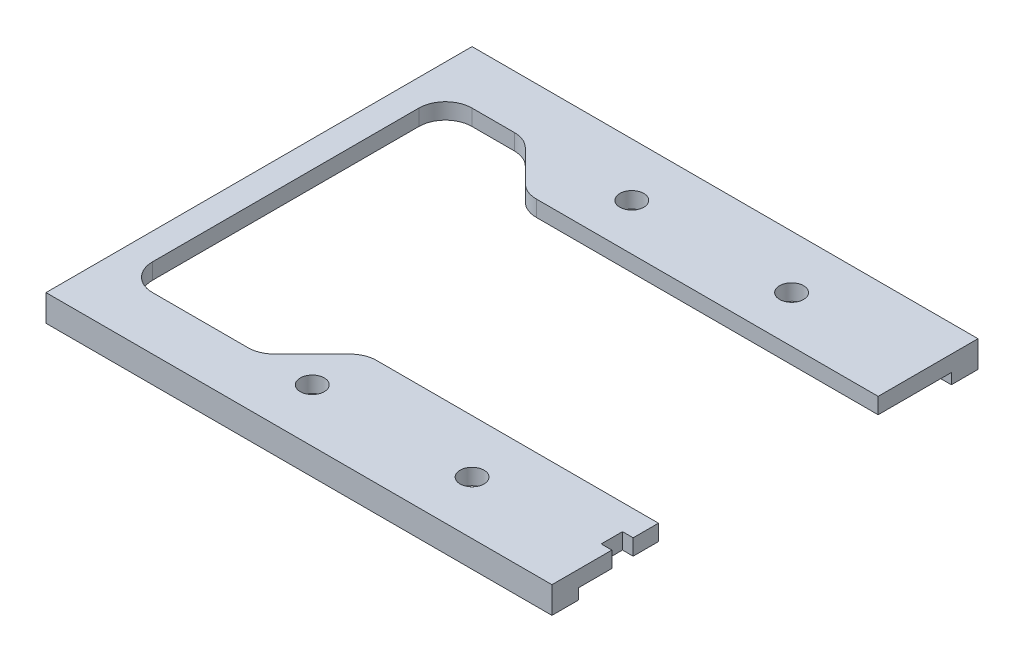
ISO-10303-21;
HEADER;
FILE_DESCRIPTION(('STEP AP214'),'2;1');
FILE_NAME('part.step','',(''),(''),'','','');
FILE_SCHEMA(('AUTOMOTIVE_DESIGN { 1 0 10303 214 1 1 1 1 }'));
ENDSEC;
DATA;
#1=APPLICATION_CONTEXT('core data for automotive mechanical design processes');
#2=APPLICATION_PROTOCOL_DEFINITION('international standard','automotive_design',2000,#1);
#3=PRODUCT_CONTEXT('',#1,'mechanical');
#4=PRODUCT('Part','Part','',(#3));
#5=PRODUCT_RELATED_PRODUCT_CATEGORY('part','',(#4));
#6=PRODUCT_DEFINITION_FORMATION('','',#4);
#7=PRODUCT_DEFINITION_CONTEXT('part definition',#1,'design');
#8=PRODUCT_DEFINITION('design','',#6,#7);
#9=PRODUCT_DEFINITION_SHAPE('','',#8);
#10=(LENGTH_UNIT() NAMED_UNIT(*) SI_UNIT(.MILLI.,.METRE.));
#11=(NAMED_UNIT(*) PLANE_ANGLE_UNIT() SI_UNIT($,.RADIAN.));
#12=(NAMED_UNIT(*) SI_UNIT($,.STERADIAN.) SOLID_ANGLE_UNIT());
#13=UNCERTAINTY_MEASURE_WITH_UNIT(LENGTH_MEASURE(1.E-05),#10,'distance_accuracy_value','');
#14=(GEOMETRIC_REPRESENTATION_CONTEXT(3) GLOBAL_UNCERTAINTY_ASSIGNED_CONTEXT((#13)) GLOBAL_UNIT_ASSIGNED_CONTEXT((#10,
#11,#12)) REPRESENTATION_CONTEXT('',''));
#15=CARTESIAN_POINT('',(0.,0.,0.));
#16=DIRECTION('',(0.,0.,1.));
#17=DIRECTION('',(1.,0.,0.));
#18=AXIS2_PLACEMENT_3D('',#15,#16,#17);
#19=CARTESIAN_POINT('',(-9.99999999999797,-4.,9.99999999999848));
#20=DIRECTION('',(-0.70710678118653,0.,0.707106781186566));
#21=DIRECTION('',(-0.707106781186566,0.,-0.70710678118653));
#22=AXIS2_PLACEMENT_3D('',#19,#20,#21);
#23=PLANE('',#22);
#24=DIRECTION('',(-0.707106781186566,0.,-0.70710678118653));
#25=VECTOR('',#24,1.);
#26=CARTESIAN_POINT('',(-9.99999999999797,6.,9.99999999999848));
#27=LINE('',#26,#25);
#28=CARTESIAN_POINT('',(-135.428932188137,6.,-115.428932188134));
#29=VERTEX_POINT('',#28);
#30=CARTESIAN_POINT('',(-147.071067811869,6.,-127.071067811865));
#31=VERTEX_POINT('',#30);
#32=EDGE_CURVE('E224',#29,#31,#27,.T.);
#33=ORIENTED_EDGE('',*,*,#32,.T.);
#34=DIRECTION('',(0.,1.,0.));
#35=VECTOR('',#34,1.);
#36=CARTESIAN_POINT('',(-147.071067811869,-4.,-127.071067811865));
#37=LINE('',#36,#35);
#38=CARTESIAN_POINT('',(-147.071067811869,0.,-127.071067811865));
#39=VERTEX_POINT('',#38);
#40=EDGE_CURVE('E243',#39,#31,#37,.T.);
#41=ORIENTED_EDGE('',*,*,#40,.F.);
#42=DIRECTION('',(0.707106781186566,0.,0.70710678118653));
#43=VECTOR('',#42,1.);
#44=CARTESIAN_POINT('',(-9.99999999999797,0.,9.99999999999848));
#45=LINE('',#44,#43);
#46=CARTESIAN_POINT('',(-135.428932188137,0.,-115.428932188134));
#47=VERTEX_POINT('',#46);
#48=EDGE_CURVE('E226',#39,#47,#45,.T.);
#49=ORIENTED_EDGE('',*,*,#48,.T.);
#50=DIRECTION('',(0.,1.,0.));
#51=VECTOR('',#50,1.);
#52=CARTESIAN_POINT('',(-135.428932188137,-4.,-115.428932188134));
#53=LINE('',#52,#51);
#54=EDGE_CURVE('E216',#47,#29,#53,.T.);
#55=ORIENTED_EDGE('',*,*,#54,.T.);
#56=EDGE_LOOP('',(#33,#41,#49,#55));
#57=FACE_BOUND('',#56,.T.);
#58=ADVANCED_FACE('F41',(#57),#23,.T.);
#59=CARTESIAN_POINT('',(0.,-4.,-112.5));
#60=DIRECTION('',(0.,0.,-1.));
#61=DIRECTION('',(1.,0.,0.));
#62=AXIS2_PLACEMENT_3D('',#59,#60,#61);
#63=PLANE('',#62);
#64=DIRECTION('',(0.,1.,0.));
#65=VECTOR('',#64,1.);
#66=CARTESIAN_POINT('',(-128.357864376272,-4.,-112.5));
#67=LINE('',#66,#65);
#68=CARTESIAN_POINT('',(-128.357864376272,6.,-112.5));
#69=VERTEX_POINT('',#68);
#70=CARTESIAN_POINT('',(-128.357864376272,0.,-112.5));
#71=VERTEX_POINT('',#70);
#72=EDGE_CURVE('E49',#69,#71,#67,.F.);
#73=ORIENTED_EDGE('',*,*,#72,.T.);
#74=DIRECTION('',(-1.,0.,0.));
#75=VECTOR('',#74,1.);
#76=CARTESIAN_POINT('',(0.,0.,-112.5));
#77=LINE('',#76,#75);
#78=CARTESIAN_POINT('',(0.,0.,-112.5));
#79=VERTEX_POINT('',#78);
#80=EDGE_CURVE('E300',#79,#71,#77,.T.);
#81=ORIENTED_EDGE('',*,*,#80,.F.);
#82=DIRECTION('',(0.,1.,0.));
#83=VECTOR('',#82,1.);
#84=CARTESIAN_POINT('',(0.,-4.,-112.5));
#85=LINE('',#84,#83);
#86=CARTESIAN_POINT('',(0.,6.,-112.5));
#87=VERTEX_POINT('',#86);
#88=EDGE_CURVE('E303',#79,#87,#85,.T.);
#89=ORIENTED_EDGE('',*,*,#88,.T.);
#90=DIRECTION('',(1.,0.,0.));
#91=VECTOR('',#90,1.);
#92=CARTESIAN_POINT('',(0.,6.,-112.5));
#93=LINE('',#92,#91);
#94=EDGE_CURVE('E301',#69,#87,#93,.T.);
#95=ORIENTED_EDGE('',*,*,#94,.F.);
#96=EDGE_LOOP('',(#73,#81,#89,#95));
#97=FACE_BOUND('',#96,.T.);
#98=ADVANCED_FACE('F297',(#97),#63,.F.);
#99=CARTESIAN_POINT('',(0.,6.,0.));
#100=DIRECTION('',(-1.,0.,0.));
#101=DIRECTION('',(0.,0.,-1.));
#102=AXIS2_PLACEMENT_3D('',#99,#100,#101);
#103=PLANE('',#102);
#104=DIRECTION('',(0.,0.,1.));
#105=VECTOR('',#104,1.);
#106=CARTESIAN_POINT('',(0.,6.,0.));
#107=LINE('',#106,#105);
#108=CARTESIAN_POINT('',(0.,6.,-12.5));
#109=VERTEX_POINT('',#108);
#110=CARTESIAN_POINT('',(0.,6.,10.));
#111=VERTEX_POINT('',#110);
#112=EDGE_CURVE('E261',#109,#111,#107,.T.);
#113=ORIENTED_EDGE('',*,*,#112,.T.);
#114=DIRECTION('',(0.,-1.,0.));
#115=VECTOR('',#114,1.);
#116=CARTESIAN_POINT('',(0.,6.,10.));
#117=LINE('',#116,#115);
#118=CARTESIAN_POINT('',(0.,-4.,10.));
#119=VERTEX_POINT('',#118);
#120=EDGE_CURVE('E388',#111,#119,#117,.T.);
#121=ORIENTED_EDGE('',*,*,#120,.T.);
#122=DIRECTION('',(0.,0.,-1.));
#123=VECTOR('',#122,1.);
#124=CARTESIAN_POINT('',(0.,-4.,10.));
#125=LINE('',#124,#123);
#126=CARTESIAN_POINT('',(0.,-4.,0.));
#127=VERTEX_POINT('',#126);
#128=EDGE_CURVE('E399',#119,#127,#125,.T.);
#129=ORIENTED_EDGE('',*,*,#128,.T.);
#130=DIRECTION('',(0.,-1.,0.));
#131=VECTOR('',#130,1.);
#132=CARTESIAN_POINT('',(0.,6.,0.));
#133=LINE('',#132,#131);
#134=CARTESIAN_POINT('',(0.,0.,0.));
#135=VERTEX_POINT('',#134);
#136=EDGE_CURVE('E387',#135,#127,#133,.T.);
#137=ORIENTED_EDGE('',*,*,#136,.F.);
#138=DIRECTION('',(0.,0.,1.));
#139=VECTOR('',#138,1.);
#140=CARTESIAN_POINT('',(0.,0.,0.));
#141=LINE('',#140,#139);
#142=CARTESIAN_POINT('',(0.,0.,-12.5));
#143=VERTEX_POINT('',#142);
#144=EDGE_CURVE('E245',#143,#135,#141,.T.);
#145=ORIENTED_EDGE('',*,*,#144,.F.);
#146=DIRECTION('',(0.,-1.,0.));
#147=VECTOR('',#146,1.);
#148=CARTESIAN_POINT('',(0.,10.,-12.5));
#149=LINE('',#148,#147);
#150=EDGE_CURVE('E352',#109,#143,#149,.T.);
#151=ORIENTED_EDGE('',*,*,#150,.F.);
#152=EDGE_LOOP('',(#113,#121,#129,#137,#145,#151));
#153=FACE_BOUND('',#152,.T.);
#154=ADVANCED_FACE('F466',(#153),#103,.F.);
#155=CARTESIAN_POINT('',(0.,6.,-30.));
#156=VERTEX_POINT('',#155);
#157=CARTESIAN_POINT('',(0.,6.,-20.5));
#158=VERTEX_POINT('',#157);
#159=EDGE_CURVE('E260',#156,#158,#107,.T.);
#160=ORIENTED_EDGE('',*,*,#159,.T.);
#161=DIRECTION('',(0.,-1.,0.));
#162=VECTOR('',#161,1.);
#163=CARTESIAN_POINT('',(0.,10.,-20.5));
#164=LINE('',#163,#162);
#165=CARTESIAN_POINT('',(0.,0.,-20.5));
#166=VERTEX_POINT('',#165);
#167=EDGE_CURVE('E351',#158,#166,#164,.T.);
#168=ORIENTED_EDGE('',*,*,#167,.T.);
#169=CARTESIAN_POINT('',(0.,0.,-30.));
#170=VERTEX_POINT('',#169);
#171=EDGE_CURVE('E268',#170,#166,#141,.T.);
#172=ORIENTED_EDGE('',*,*,#171,.F.);
#173=DIRECTION('',(0.,1.,0.));
#174=VECTOR('',#173,1.);
#175=CARTESIAN_POINT('',(0.,-4.,-30.));
#176=LINE('',#175,#174);
#177=EDGE_CURVE('E305',#170,#156,#176,.T.);
#178=ORIENTED_EDGE('',*,*,#177,.T.);
#179=EDGE_LOOP('',(#160,#168,#172,#178));
#180=FACE_BOUND('',#179,.T.);
#181=ADVANCED_FACE('F576',(#180),#103,.F.);
#182=CARTESIAN_POINT('',(-2.4541772123293E-13,0.,-140.000000000001));
#183=VERTEX_POINT('',#182);
#184=EDGE_CURVE('E265',#183,#79,#141,.T.);
#185=ORIENTED_EDGE('',*,*,#184,.F.);
#186=DIRECTION('',(0.,1.,0.));
#187=VECTOR('',#186,1.);
#188=CARTESIAN_POINT('',(0.,6.,-140.000000000001));
#189=LINE('',#188,#187);
#190=CARTESIAN_POINT('',(-4.09029535388217E-13,-4.,-140.000000000001));
#191=VERTEX_POINT('',#190);
#192=EDGE_CURVE('E369',#191,#183,#189,.T.);
#193=ORIENTED_EDGE('',*,*,#192,.F.);
#194=DIRECTION('',(0.,0.,1.));
#195=VECTOR('',#194,1.);
#196=CARTESIAN_POINT('',(-4.09029535388217E-13,-4.,-150.000000000001));
#197=LINE('',#196,#195);
#198=CARTESIAN_POINT('',(-4.09029535388217E-13,-4.,-150.000000000001));
#199=VERTEX_POINT('',#198);
#200=EDGE_CURVE('E381',#199,#191,#197,.T.);
#201=ORIENTED_EDGE('',*,*,#200,.F.);
#202=DIRECTION('',(0.,1.,0.));
#203=VECTOR('',#202,1.);
#204=CARTESIAN_POINT('',(0.,6.,-150.000000000001));
#205=LINE('',#204,#203);
#206=CARTESIAN_POINT('',(0.,6.,-150.000000000001));
#207=VERTEX_POINT('',#206);
#208=EDGE_CURVE('E370',#199,#207,#205,.T.);
#209=ORIENTED_EDGE('',*,*,#208,.T.);
#210=EDGE_CURVE('E257',#207,#87,#107,.T.);
#211=ORIENTED_EDGE('',*,*,#210,.T.);
#212=ORIENTED_EDGE('',*,*,#88,.F.);
#213=EDGE_LOOP('',(#185,#193,#201,#209,#211,#212));
#214=FACE_BOUND('',#213,.T.);
#215=ADVANCED_FACE('F43',(#214),#103,.F.);
#216=CARTESIAN_POINT('',(-190.,6.,0.));
#217=DIRECTION('',(1.,0.,0.));
#218=DIRECTION('',(0.,0.,1.));
#219=AXIS2_PLACEMENT_3D('',#216,#217,#218);
#220=PLANE('',#219);
#221=DIRECTION('',(0.,0.,-1.));
#222=VECTOR('',#221,1.);
#223=CARTESIAN_POINT('',(-190.,6.,0.));
#224=LINE('',#223,#222);
#225=CARTESIAN_POINT('',(-190.,6.,10.));
#226=VERTEX_POINT('',#225);
#227=CARTESIAN_POINT('',(-190.,5.99999999999998,-150.000000000001));
#228=VERTEX_POINT('',#227);
#229=EDGE_CURVE('E259',#226,#228,#224,.T.);
#230=ORIENTED_EDGE('',*,*,#229,.T.);
#231=DIRECTION('',(0.,-1.,0.));
#232=VECTOR('',#231,1.);
#233=CARTESIAN_POINT('',(-190.,5.99999999999998,-150.000000000001));
#234=LINE('',#233,#232);
#235=CARTESIAN_POINT('',(-190.,-4.,-150.000000000001));
#236=VERTEX_POINT('',#235);
#237=EDGE_CURVE('E376',#228,#236,#234,.T.);
#238=ORIENTED_EDGE('',*,*,#237,.T.);
#239=DIRECTION('',(0.,0.,1.));
#240=VECTOR('',#239,1.);
#241=CARTESIAN_POINT('',(-190.,-4.,0.));
#242=LINE('',#241,#240);
#243=CARTESIAN_POINT('',(-190.,-4.,10.));
#244=VERTEX_POINT('',#243);
#245=EDGE_CURVE('E409',#236,#244,#242,.T.);
#246=ORIENTED_EDGE('',*,*,#245,.T.);
#247=DIRECTION('',(0.,1.,0.));
#248=VECTOR('',#247,1.);
#249=CARTESIAN_POINT('',(-190.,6.,10.));
#250=LINE('',#249,#248);
#251=EDGE_CURVE('E394',#244,#226,#250,.T.);
#252=ORIENTED_EDGE('',*,*,#251,.T.);
#253=EDGE_LOOP('',(#230,#238,#246,#252));
#254=FACE_BOUND('',#253,.T.);
#255=ADVANCED_FACE('F569',(#254),#220,.F.);
#256=CARTESIAN_POINT('',(0.,6.,0.));
#257=DIRECTION('',(0.,-1.,0.));
#258=DIRECTION('',(0.,0.,-1.));
#259=AXIS2_PLACEMENT_3D('',#256,#257,#258);
#260=PLANE('',#259);
#261=CARTESIAN_POINT('',(-50.,6.,-130.000000000001));
#262=DIRECTION('',(0.,-1.,0.));
#263=DIRECTION('',(0.,0.,-1.));
#264=AXIS2_PLACEMENT_3D('',#261,#262,#263);
#265=CIRCLE('',#264,4.50000000000001);
#266=CARTESIAN_POINT('',(-50.,6.,-134.500000000001));
#267=VERTEX_POINT('',#266);
#268=EDGE_CURVE('E333',#267,#267,#265,.T.);
#269=ORIENTED_EDGE('',*,*,#268,.T.);
#270=EDGE_LOOP('',(#269));
#271=FACE_BOUND('',#270,.T.);
#272=CARTESIAN_POINT('',(-110.,6.,-130.000000000001));
#273=DIRECTION('',(0.,-1.,0.));
#274=DIRECTION('',(0.,0.,-1.));
#275=AXIS2_PLACEMENT_3D('',#272,#273,#274);
#276=CIRCLE('',#275,4.50000000000001);
#277=CARTESIAN_POINT('',(-110.,6.,-134.500000000001));
#278=VERTEX_POINT('',#277);
#279=EDGE_CURVE('E327',#278,#278,#276,.T.);
#280=ORIENTED_EDGE('',*,*,#279,.T.);
#281=EDGE_LOOP('',(#280));
#282=FACE_BOUND('',#281,.T.);
#283=CARTESIAN_POINT('',(-110.,6.,-10.));
#284=DIRECTION('',(0.,-1.,0.));
#285=DIRECTION('',(0.,0.,1.));
#286=AXIS2_PLACEMENT_3D('',#283,#284,#285);
#287=CIRCLE('',#286,4.5);
#288=CARTESIAN_POINT('',(-110.,6.,-5.5));
#289=VERTEX_POINT('',#288);
#290=EDGE_CURVE('E320',#289,#289,#287,.T.);
#291=ORIENTED_EDGE('',*,*,#290,.T.);
#292=EDGE_LOOP('',(#291));
#293=FACE_BOUND('',#292,.T.);
#294=CARTESIAN_POINT('',(-50.,6.,-10.));
#295=DIRECTION('',(0.,-1.,0.));
#296=DIRECTION('',(0.,0.,1.));
#297=AXIS2_PLACEMENT_3D('',#294,#295,#296);
#298=CIRCLE('',#297,4.5);
#299=CARTESIAN_POINT('',(-50.,6.,-5.5));
#300=VERTEX_POINT('',#299);
#301=EDGE_CURVE('E338',#300,#300,#298,.T.);
#302=ORIENTED_EDGE('',*,*,#301,.T.);
#303=EDGE_LOOP('',(#302));
#304=FACE_BOUND('',#303,.T.);
#305=DIRECTION('',(0.707106781186548,0.,-0.707106781186547));
#306=VECTOR('',#305,1.);
#307=CARTESIAN_POINT('',(-70.0000000000013,6.,-70.0000000000014));
#308=LINE('',#307,#306);
#309=CARTESIAN_POINT('',(-127.071067811868,6.,-12.9289321881345));
#310=VERTEX_POINT('',#309);
#311=CARTESIAN_POINT('',(-112.928932188137,6.,-27.0710678118655));
#312=VERTEX_POINT('',#311);
#313=EDGE_CURVE('E418',#310,#312,#308,.T.);
#314=ORIENTED_EDGE('',*,*,#313,.F.);
#315=CARTESIAN_POINT('',(-134.142135623734,6.,-20.));
#316=DIRECTION('',(0.,-1.,0.));
#317=DIRECTION('',(0.,0.,1.));
#318=AXIS2_PLACEMENT_3D('',#315,#316,#317);
#319=CIRCLE('',#318,10.);
#320=CARTESIAN_POINT('',(-134.142135623734,6.,-10.));
#321=VERTEX_POINT('',#320);
#322=EDGE_CURVE('E421',#310,#321,#319,.T.);
#323=ORIENTED_EDGE('',*,*,#322,.T.);
#324=DIRECTION('',(1.,0.,0.));
#325=VECTOR('',#324,1.);
#326=CARTESIAN_POINT('',(0.,6.,-9.99999999999999));
#327=LINE('',#326,#325);
#328=CARTESIAN_POINT('',(-170.000000000001,6.,-10.));
#329=VERTEX_POINT('',#328);
#330=EDGE_CURVE('E424',#329,#321,#327,.T.);
#331=ORIENTED_EDGE('',*,*,#330,.F.);
#332=CARTESIAN_POINT('',(-170.000000000001,6.,-20.));
#333=DIRECTION('',(0.,-1.,0.));
#334=DIRECTION('',(0.,0.,1.));
#335=AXIS2_PLACEMENT_3D('',#332,#333,#334);
#336=CIRCLE('',#335,10.);
#337=CARTESIAN_POINT('',(-180.000000000001,6.,-20.));
#338=VERTEX_POINT('',#337);
#339=EDGE_CURVE('E427',#338,#329,#336,.F.);
#340=ORIENTED_EDGE('',*,*,#339,.F.);
#341=DIRECTION('',(0.,0.,1.));
#342=VECTOR('',#341,1.);
#343=CARTESIAN_POINT('',(-180.000000000001,6.,0.));
#344=LINE('',#343,#342);
#345=CARTESIAN_POINT('',(-180.000000000001,6.,-120.));
#346=VERTEX_POINT('',#345);
#347=EDGE_CURVE('E430',#346,#338,#344,.T.);
#348=ORIENTED_EDGE('',*,*,#347,.F.);
#349=CARTESIAN_POINT('',(-170.000000000001,6.,-120.));
#350=DIRECTION('',(0.,-1.,0.));
#351=DIRECTION('',(0.,0.,1.));
#352=AXIS2_PLACEMENT_3D('',#349,#350,#351);
#353=CIRCLE('',#352,10.);
#354=CARTESIAN_POINT('',(-170.000000000001,6.,-130.));
#355=VERTEX_POINT('',#354);
#356=EDGE_CURVE('E433',#355,#346,#353,.F.);
#357=ORIENTED_EDGE('',*,*,#356,.F.);
#358=DIRECTION('',(-1.,0.,0.));
#359=VECTOR('',#358,1.);
#360=CARTESIAN_POINT('',(3.18549499616373E-12,6.,-129.999999999996));
#361=LINE('',#360,#359);
#362=CARTESIAN_POINT('',(-154.142135623734,6.,-130.));
#363=VERTEX_POINT('',#362);
#364=EDGE_CURVE('E239',#363,#355,#361,.T.);
#365=ORIENTED_EDGE('',*,*,#364,.F.);
#366=CARTESIAN_POINT('',(-154.142135623732,6.,-120.));
#367=DIRECTION('',(0.,-1.,0.));
#368=DIRECTION('',(0.,0.,1.));
#369=AXIS2_PLACEMENT_3D('',#366,#367,#368);
#370=CIRCLE('',#369,9.9999999999992);
#371=EDGE_CURVE('E233',#31,#363,#370,.F.);
#372=ORIENTED_EDGE('',*,*,#371,.F.);
#373=ORIENTED_EDGE('',*,*,#32,.F.);
#374=CARTESIAN_POINT('',(-128.357864376272,6.,-122.5));
#375=DIRECTION('',(0.,1.,0.));
#376=DIRECTION('',(0.,0.,1.));
#377=AXIS2_PLACEMENT_3D('',#374,#375,#376);
#378=CIRCLE('',#377,10.);
#379=EDGE_CURVE('E62',#29,#69,#378,.T.);
#380=ORIENTED_EDGE('',*,*,#379,.T.);
#381=ORIENTED_EDGE('',*,*,#94,.T.);
#382=ORIENTED_EDGE('',*,*,#210,.F.);
#383=DIRECTION('',(-1.,0.,0.));
#384=VECTOR('',#383,1.);
#385=CARTESIAN_POINT('',(0.,6.,-150.000000000001));
#386=LINE('',#385,#384);
#387=EDGE_CURVE('E373',#207,#228,#386,.T.);
#388=ORIENTED_EDGE('',*,*,#387,.T.);
#389=ORIENTED_EDGE('',*,*,#229,.F.);
#390=DIRECTION('',(1.,0.,0.));
#391=VECTOR('',#390,1.);
#392=CARTESIAN_POINT('',(0.,6.,10.));
#393=LINE('',#392,#391);
#394=EDGE_CURVE('E397',#226,#111,#393,.T.);
#395=ORIENTED_EDGE('',*,*,#394,.T.);
#396=ORIENTED_EDGE('',*,*,#112,.F.);
#397=DIRECTION('',(1.,0.,0.));
#398=VECTOR('',#397,1.);
#399=CARTESIAN_POINT('',(0.,6.,-12.5));
#400=LINE('',#399,#398);
#401=CARTESIAN_POINT('',(-4.,6.,-12.5));
#402=VERTEX_POINT('',#401);
#403=EDGE_CURVE('E367',#402,#109,#400,.T.);
#404=ORIENTED_EDGE('',*,*,#403,.F.);
#405=DIRECTION('',(0.,0.,1.));
#406=VECTOR('',#405,1.);
#407=CARTESIAN_POINT('',(-4.,6.,0.));
#408=LINE('',#407,#406);
#409=CARTESIAN_POINT('',(-4.,6.,-20.5));
#410=VERTEX_POINT('',#409);
#411=EDGE_CURVE('E364',#410,#402,#408,.T.);
#412=ORIENTED_EDGE('',*,*,#411,.F.);
#413=DIRECTION('',(-1.,0.,0.));
#414=VECTOR('',#413,1.);
#415=CARTESIAN_POINT('',(0.,6.,-20.5));
#416=LINE('',#415,#414);
#417=EDGE_CURVE('E355',#158,#410,#416,.T.);
#418=ORIENTED_EDGE('',*,*,#417,.F.);
#419=ORIENTED_EDGE('',*,*,#159,.F.);
#420=DIRECTION('',(-1.,0.,0.));
#421=VECTOR('',#420,1.);
#422=CARTESIAN_POINT('',(0.,6.,-30.));
#423=LINE('',#422,#421);
#424=CARTESIAN_POINT('',(-105.857864376272,6.,-30.));
#425=VERTEX_POINT('',#424);
#426=EDGE_CURVE('E306',#156,#425,#423,.T.);
#427=ORIENTED_EDGE('',*,*,#426,.T.);
#428=CARTESIAN_POINT('',(-105.857864376272,6.,-20.));
#429=DIRECTION('',(0.,1.,0.));
#430=DIRECTION('',(0.,0.,-1.));
#431=AXIS2_PLACEMENT_3D('',#428,#429,#430);
#432=CIRCLE('',#431,10.);
#433=EDGE_CURVE('E219',#425,#312,#432,.T.);
#434=ORIENTED_EDGE('',*,*,#433,.T.);
#435=EDGE_LOOP('',(#314,#323,#331,#340,#348,#357,#365,#372,#373,#380,#381,#382,#388,#389,#395,
#396,#404,#412,#418,#419,#427,#434));
#436=FACE_BOUND('',#435,.T.);
#437=ADVANCED_FACE('F230',(#271,#282,#293,#304,#436),#260,.F.);
#438=CARTESIAN_POINT('',(0.,0.,0.));
#439=DIRECTION('',(0.,-1.,0.));
#440=DIRECTION('',(0.,0.,-1.));
#441=AXIS2_PLACEMENT_3D('',#438,#439,#440);
#442=PLANE('',#441);
#443=CARTESIAN_POINT('',(-105.857864376272,0.,-20.));
#444=DIRECTION('',(0.,1.,0.));
#445=DIRECTION('',(0.,0.,-1.));
#446=AXIS2_PLACEMENT_3D('',#443,#444,#445);
#447=CIRCLE('',#446,10.);
#448=CARTESIAN_POINT('',(-112.928932188137,0.,-27.0710678118655));
#449=VERTEX_POINT('',#448);
#450=CARTESIAN_POINT('',(-105.857864376272,0.,-30.));
#451=VERTEX_POINT('',#450);
#452=EDGE_CURVE('E311',#449,#451,#447,.F.);
#453=ORIENTED_EDGE('',*,*,#452,.T.);
#454=DIRECTION('',(1.,0.,0.));
#455=VECTOR('',#454,1.);
#456=CARTESIAN_POINT('',(0.,0.,-30.));
#457=LINE('',#456,#455);
#458=EDGE_CURVE('E315',#451,#170,#457,.T.);
#459=ORIENTED_EDGE('',*,*,#458,.T.);
#460=ORIENTED_EDGE('',*,*,#171,.T.);
#461=DIRECTION('',(-1.,0.,0.));
#462=VECTOR('',#461,1.);
#463=CARTESIAN_POINT('',(0.,0.,-20.5));
#464=LINE('',#463,#462);
#465=CARTESIAN_POINT('',(-4.,0.,-20.5));
#466=VERTEX_POINT('',#465);
#467=EDGE_CURVE('E341',#166,#466,#464,.T.);
#468=ORIENTED_EDGE('',*,*,#467,.T.);
#469=DIRECTION('',(0.,0.,1.));
#470=VECTOR('',#469,1.);
#471=CARTESIAN_POINT('',(-4.,0.,-20.5));
#472=LINE('',#471,#470);
#473=CARTESIAN_POINT('',(-4.,0.,-12.5));
#474=VERTEX_POINT('',#473);
#475=EDGE_CURVE('E346',#466,#474,#472,.T.);
#476=ORIENTED_EDGE('',*,*,#475,.T.);
#477=DIRECTION('',(1.,0.,0.));
#478=VECTOR('',#477,1.);
#479=CARTESIAN_POINT('',(0.,0.,-12.5));
#480=LINE('',#479,#478);
#481=EDGE_CURVE('E349',#474,#143,#480,.T.);
#482=ORIENTED_EDGE('',*,*,#481,.T.);
#483=ORIENTED_EDGE('',*,*,#144,.T.);
#484=DIRECTION('',(-1.,0.,0.));
#485=VECTOR('',#484,1.);
#486=CARTESIAN_POINT('',(0.,0.,0.));
#487=LINE('',#486,#485);
#488=CARTESIAN_POINT('',(-185.,0.,0.));
#489=VERTEX_POINT('',#488);
#490=EDGE_CURVE('E267',#135,#489,#487,.T.);
#491=ORIENTED_EDGE('',*,*,#490,.T.);
#492=DIRECTION('',(0.,0.,-1.));
#493=VECTOR('',#492,1.);
#494=CARTESIAN_POINT('',(-185.,0.,0.));
#495=LINE('',#494,#493);
#496=CARTESIAN_POINT('',(-185.,0.,-140.));
#497=VERTEX_POINT('',#496);
#498=EDGE_CURVE('E405',#489,#497,#495,.T.);
#499=ORIENTED_EDGE('',*,*,#498,.T.);
#500=DIRECTION('',(1.,0.,0.));
#501=VECTOR('',#500,1.);
#502=CARTESIAN_POINT('',(0.,0.,-140.000000000001));
#503=LINE('',#502,#501);
#504=EDGE_CURVE('E271',#497,#183,#503,.T.);
#505=ORIENTED_EDGE('',*,*,#504,.T.);
#506=ORIENTED_EDGE('',*,*,#184,.T.);
#507=ORIENTED_EDGE('',*,*,#80,.T.);
#508=CARTESIAN_POINT('',(-128.357864376272,0.,-122.5));
#509=DIRECTION('',(0.,1.,0.));
#510=DIRECTION('',(0.,0.,-1.));
#511=AXIS2_PLACEMENT_3D('',#508,#509,#510);
#512=CIRCLE('',#511,10.);
#513=EDGE_CURVE('E534',#71,#47,#512,.F.);
#514=ORIENTED_EDGE('',*,*,#513,.T.);
#515=ORIENTED_EDGE('',*,*,#48,.F.);
#516=CARTESIAN_POINT('',(-154.142135623732,0.,-120.));
#517=DIRECTION('',(0.,1.,0.));
#518=DIRECTION('',(0.,0.,-1.));
#519=AXIS2_PLACEMENT_3D('',#516,#517,#518);
#520=CIRCLE('',#519,9.9999999999992);
#521=CARTESIAN_POINT('',(-154.142135623734,0.,-130.));
#522=VERTEX_POINT('',#521);
#523=EDGE_CURVE('E293',#522,#39,#520,.F.);
#524=ORIENTED_EDGE('',*,*,#523,.F.);
#525=DIRECTION('',(1.,0.,0.));
#526=VECTOR('',#525,1.);
#527=CARTESIAN_POINT('',(3.18549499616373E-12,0.,-129.999999999996));
#528=LINE('',#527,#526);
#529=CARTESIAN_POINT('',(-170.000000000001,0.,-130.));
#530=VERTEX_POINT('',#529);
#531=EDGE_CURVE('E290',#530,#522,#528,.T.);
#532=ORIENTED_EDGE('',*,*,#531,.F.);
#533=CARTESIAN_POINT('',(-170.000000000001,0.,-120.));
#534=DIRECTION('',(0.,1.,0.));
#535=DIRECTION('',(0.,0.,-1.));
#536=AXIS2_PLACEMENT_3D('',#533,#534,#535);
#537=CIRCLE('',#536,10.);
#538=CARTESIAN_POINT('',(-180.000000000001,0.,-120.));
#539=VERTEX_POINT('',#538);
#540=EDGE_CURVE('E287',#539,#530,#537,.F.);
#541=ORIENTED_EDGE('',*,*,#540,.F.);
#542=DIRECTION('',(0.,0.,-1.));
#543=VECTOR('',#542,1.);
#544=CARTESIAN_POINT('',(-180.000000000001,0.,0.));
#545=LINE('',#544,#543);
#546=CARTESIAN_POINT('',(-180.000000000001,0.,-20.));
#547=VERTEX_POINT('',#546);
#548=EDGE_CURVE('E284',#547,#539,#545,.T.);
#549=ORIENTED_EDGE('',*,*,#548,.F.);
#550=CARTESIAN_POINT('',(-170.000000000001,0.,-20.));
#551=DIRECTION('',(0.,1.,0.));
#552=DIRECTION('',(0.,0.,-1.));
#553=AXIS2_PLACEMENT_3D('',#550,#551,#552);
#554=CIRCLE('',#553,10.);
#555=CARTESIAN_POINT('',(-170.000000000001,0.,-10.));
#556=VERTEX_POINT('',#555);
#557=EDGE_CURVE('E281',#556,#547,#554,.F.);
#558=ORIENTED_EDGE('',*,*,#557,.F.);
#559=DIRECTION('',(-1.,0.,0.));
#560=VECTOR('',#559,1.);
#561=CARTESIAN_POINT('',(0.,0.,-9.99999999999999));
#562=LINE('',#561,#560);
#563=CARTESIAN_POINT('',(-134.142135623734,0.,-10.));
#564=VERTEX_POINT('',#563);
#565=EDGE_CURVE('E278',#564,#556,#562,.T.);
#566=ORIENTED_EDGE('',*,*,#565,.F.);
#567=CARTESIAN_POINT('',(-134.142135623734,0.,-20.));
#568=DIRECTION('',(0.,1.,0.));
#569=DIRECTION('',(0.,0.,-1.));
#570=AXIS2_PLACEMENT_3D('',#567,#568,#569);
#571=CIRCLE('',#570,10.);
#572=CARTESIAN_POINT('',(-127.071067811868,0.,-12.9289321881345));
#573=VERTEX_POINT('',#572);
#574=EDGE_CURVE('E275',#564,#573,#571,.T.);
#575=ORIENTED_EDGE('',*,*,#574,.T.);
#576=DIRECTION('',(-0.707106781186548,0.,0.707106781186547));
#577=VECTOR('',#576,1.);
#578=CARTESIAN_POINT('',(-70.0000000000013,0.,-70.0000000000014));
#579=LINE('',#578,#577);
#580=EDGE_CURVE('E264',#449,#573,#579,.T.);
#581=ORIENTED_EDGE('',*,*,#580,.F.);
#582=EDGE_LOOP('',(#453,#459,#460,#468,#476,#482,#483,#491,#499,#505,#506,#507,#514,#515,#524,
#532,#541,#549,#558,#566,#575,#581));
#583=FACE_BOUND('',#582,.T.);
#584=CARTESIAN_POINT('',(-50.,0.,-130.000000000001));
#585=DIRECTION('',(0.,-1.,0.));
#586=DIRECTION('',(0.,0.,-1.));
#587=AXIS2_PLACEMENT_3D('',#584,#585,#586);
#588=CIRCLE('',#587,4.50000000000001);
#589=CARTESIAN_POINT('',(-50.,0.,-134.500000000001));
#590=VERTEX_POINT('',#589);
#591=EDGE_CURVE('E319',#590,#590,#588,.T.);
#592=ORIENTED_EDGE('',*,*,#591,.F.);
#593=EDGE_LOOP('',(#592));
#594=FACE_BOUND('',#593,.T.);
#595=CARTESIAN_POINT('',(-110.,0.,-130.000000000001));
#596=DIRECTION('',(0.,-1.,0.));
#597=DIRECTION('',(0.,0.,-1.));
#598=AXIS2_PLACEMENT_3D('',#595,#596,#597);
#599=CIRCLE('',#598,4.50000000000001);
#600=CARTESIAN_POINT('',(-110.,0.,-134.500000000001));
#601=VERTEX_POINT('',#600);
#602=EDGE_CURVE('E330',#601,#601,#599,.T.);
#603=ORIENTED_EDGE('',*,*,#602,.F.);
#604=EDGE_LOOP('',(#603));
#605=FACE_BOUND('',#604,.T.);
#606=CARTESIAN_POINT('',(-110.,0.,-10.));
#607=DIRECTION('',(0.,-1.,0.));
#608=DIRECTION('',(0.,0.,1.));
#609=AXIS2_PLACEMENT_3D('',#606,#607,#608);
#610=CIRCLE('',#609,4.5);
#611=CARTESIAN_POINT('',(-110.,0.,-5.5));
#612=VERTEX_POINT('',#611);
#613=EDGE_CURVE('E324',#612,#612,#610,.T.);
#614=ORIENTED_EDGE('',*,*,#613,.F.);
#615=EDGE_LOOP('',(#614));
#616=FACE_BOUND('',#615,.T.);
#617=CARTESIAN_POINT('',(-50.,0.,-10.));
#618=DIRECTION('',(0.,-1.,0.));
#619=DIRECTION('',(0.,0.,1.));
#620=AXIS2_PLACEMENT_3D('',#617,#618,#619);
#621=CIRCLE('',#620,4.5);
#622=CARTESIAN_POINT('',(-50.,0.,-5.5));
#623=VERTEX_POINT('',#622);
#624=EDGE_CURVE('E323',#623,#623,#621,.T.);
#625=ORIENTED_EDGE('',*,*,#624,.F.);
#626=EDGE_LOOP('',(#625));
#627=FACE_BOUND('',#626,.T.);
#628=ADVANCED_FACE('F449',(#583,#594,#605,#616,#627),#442,.T.);
#629=CARTESIAN_POINT('',(-154.142135623732,-4.,-120.));
#630=DIRECTION('',(0.,1.,0.));
#631=DIRECTION('',(0.,0.,1.));
#632=AXIS2_PLACEMENT_3D('',#629,#630,#631);
#633=CYLINDRICAL_SURFACE('',#632,9.9999999999992);
#634=DIRECTION('',(0.,1.,0.));
#635=VECTOR('',#634,1.);
#636=CARTESIAN_POINT('',(-154.142135623734,-4.,-130.));
#637=LINE('',#636,#635);
#638=EDGE_CURVE('E246',#522,#363,#637,.T.);
#639=ORIENTED_EDGE('',*,*,#638,.F.);
#640=ORIENTED_EDGE('',*,*,#523,.T.);
#641=ORIENTED_EDGE('',*,*,#40,.T.);
#642=ORIENTED_EDGE('',*,*,#371,.T.);
#643=EDGE_LOOP('',(#639,#640,#641,#642));
#644=FACE_BOUND('',#643,.T.);
#645=ADVANCED_FACE('F452',(#644),#633,.F.);
#646=CARTESIAN_POINT('',(3.18549499616373E-12,-4.,-129.999999999996));
#647=DIRECTION('',(0.,0.,1.));
#648=DIRECTION('',(-1.,0.,0.));
#649=AXIS2_PLACEMENT_3D('',#646,#647,#648);
#650=PLANE('',#649);
#651=DIRECTION('',(0.,1.,0.));
#652=VECTOR('',#651,1.);
#653=CARTESIAN_POINT('',(-170.000000000001,-4.,-130.));
#654=LINE('',#653,#652);
#655=EDGE_CURVE('E248',#530,#355,#654,.T.);
#656=ORIENTED_EDGE('',*,*,#655,.F.);
#657=ORIENTED_EDGE('',*,*,#531,.T.);
#658=ORIENTED_EDGE('',*,*,#638,.T.);
#659=ORIENTED_EDGE('',*,*,#364,.T.);
#660=EDGE_LOOP('',(#656,#657,#658,#659));
#661=FACE_BOUND('',#660,.T.);
#662=ADVANCED_FACE('F438',(#661),#650,.T.);
#663=CARTESIAN_POINT('',(-170.000000000001,-4.,-120.));
#664=DIRECTION('',(0.,1.,0.));
#665=DIRECTION('',(0.,0.,1.));
#666=AXIS2_PLACEMENT_3D('',#663,#664,#665);
#667=CYLINDRICAL_SURFACE('',#666,10.);
#668=DIRECTION('',(0.,1.,0.));
#669=VECTOR('',#668,1.);
#670=CARTESIAN_POINT('',(-180.000000000001,-4.,-120.));
#671=LINE('',#670,#669);
#672=EDGE_CURVE('E250',#539,#346,#671,.T.);
#673=ORIENTED_EDGE('',*,*,#672,.F.);
#674=ORIENTED_EDGE('',*,*,#540,.T.);
#675=ORIENTED_EDGE('',*,*,#655,.T.);
#676=ORIENTED_EDGE('',*,*,#356,.T.);
#677=EDGE_LOOP('',(#673,#674,#675,#676));
#678=FACE_BOUND('',#677,.T.);
#679=ADVANCED_FACE('F442',(#678),#667,.F.);
#680=CARTESIAN_POINT('',(-180.000000000001,-4.,0.));
#681=DIRECTION('',(1.,0.,0.));
#682=DIRECTION('',(0.,0.,1.));
#683=AXIS2_PLACEMENT_3D('',#680,#681,#682);
#684=PLANE('',#683);
#685=DIRECTION('',(0.,1.,0.));
#686=VECTOR('',#685,1.);
#687=CARTESIAN_POINT('',(-180.000000000001,-4.,-20.));
#688=LINE('',#687,#686);
#689=EDGE_CURVE('E252',#547,#338,#688,.T.);
#690=ORIENTED_EDGE('',*,*,#689,.F.);
#691=ORIENTED_EDGE('',*,*,#548,.T.);
#692=ORIENTED_EDGE('',*,*,#672,.T.);
#693=ORIENTED_EDGE('',*,*,#347,.T.);
#694=EDGE_LOOP('',(#690,#691,#692,#693));
#695=FACE_BOUND('',#694,.T.);
#696=ADVANCED_FACE('F552',(#695),#684,.T.);
#697=CARTESIAN_POINT('',(-170.000000000001,-4.,-20.));
#698=DIRECTION('',(0.,1.,0.));
#699=DIRECTION('',(0.,0.,1.));
#700=AXIS2_PLACEMENT_3D('',#697,#698,#699);
#701=CYLINDRICAL_SURFACE('',#700,10.);
#702=DIRECTION('',(0.,1.,0.));
#703=VECTOR('',#702,1.);
#704=CARTESIAN_POINT('',(-170.000000000001,-4.,-10.));
#705=LINE('',#704,#703);
#706=EDGE_CURVE('E254',#556,#329,#705,.T.);
#707=ORIENTED_EDGE('',*,*,#706,.F.);
#708=ORIENTED_EDGE('',*,*,#557,.T.);
#709=ORIENTED_EDGE('',*,*,#689,.T.);
#710=ORIENTED_EDGE('',*,*,#339,.T.);
#711=EDGE_LOOP('',(#707,#708,#709,#710));
#712=FACE_BOUND('',#711,.T.);
#713=ADVANCED_FACE('F550',(#712),#701,.F.);
#714=CARTESIAN_POINT('',(0.,-4.,-9.99999999999999));
#715=DIRECTION('',(0.,0.,-1.));
#716=DIRECTION('',(1.,0.,0.));
#717=AXIS2_PLACEMENT_3D('',#714,#715,#716);
#718=PLANE('',#717);
#719=DIRECTION('',(0.,1.,0.));
#720=VECTOR('',#719,1.);
#721=CARTESIAN_POINT('',(-134.142135623734,-4.,-10.));
#722=LINE('',#721,#720);
#723=EDGE_CURVE('E237',#564,#321,#722,.T.);
#724=ORIENTED_EDGE('',*,*,#723,.F.);
#725=ORIENTED_EDGE('',*,*,#565,.T.);
#726=ORIENTED_EDGE('',*,*,#706,.T.);
#727=ORIENTED_EDGE('',*,*,#330,.T.);
#728=EDGE_LOOP('',(#724,#725,#726,#727));
#729=FACE_BOUND('',#728,.T.);
#730=ADVANCED_FACE('F546',(#729),#718,.T.);
#731=CARTESIAN_POINT('',(-134.142135623734,-4.,-20.));
#732=DIRECTION('',(0.,1.,0.));
#733=DIRECTION('',(0.,0.,1.));
#734=AXIS2_PLACEMENT_3D('',#731,#732,#733);
#735=CYLINDRICAL_SURFACE('',#734,10.);
#736=ORIENTED_EDGE('',*,*,#574,.F.);
#737=ORIENTED_EDGE('',*,*,#723,.T.);
#738=ORIENTED_EDGE('',*,*,#322,.F.);
#739=DIRECTION('',(0.,1.,0.));
#740=VECTOR('',#739,1.);
#741=CARTESIAN_POINT('',(-127.071067811868,-4.,-12.9289321881345));
#742=LINE('',#741,#740);
#743=EDGE_CURVE('E235',#573,#310,#742,.T.);
#744=ORIENTED_EDGE('',*,*,#743,.F.);
#745=EDGE_LOOP('',(#736,#737,#738,#744));
#746=FACE_BOUND('',#745,.T.);
#747=ADVANCED_FACE('F543',(#746),#735,.F.);
#748=CARTESIAN_POINT('',(-70.0000000000013,-4.,-70.0000000000014));
#749=DIRECTION('',(-0.707106781186547,0.,-0.707106781186548));
#750=DIRECTION('',(0.707106781186548,0.,-0.707106781186547));
#751=AXIS2_PLACEMENT_3D('',#748,#749,#750);
#752=PLANE('',#751);
#753=DIRECTION('',(0.,1.,0.));
#754=VECTOR('',#753,1.);
#755=CARTESIAN_POINT('',(-112.928932188137,-4.,-27.0710678118655));
#756=LINE('',#755,#754);
#757=EDGE_CURVE('E227',#449,#312,#756,.T.);
#758=ORIENTED_EDGE('',*,*,#757,.F.);
#759=ORIENTED_EDGE('',*,*,#580,.T.);
#760=ORIENTED_EDGE('',*,*,#743,.T.);
#761=ORIENTED_EDGE('',*,*,#313,.T.);
#762=EDGE_LOOP('',(#758,#759,#760,#761));
#763=FACE_BOUND('',#762,.T.);
#764=ADVANCED_FACE('F473',(#763),#752,.T.);
#765=CARTESIAN_POINT('',(-185.,-4.,0.));
#766=DIRECTION('',(-1.,0.,0.));
#767=DIRECTION('',(0.,0.,-1.));
#768=AXIS2_PLACEMENT_3D('',#765,#766,#767);
#769=PLANE('',#768);
#770=ORIENTED_EDGE('',*,*,#498,.F.);
#771=DIRECTION('',(0.,1.,0.));
#772=VECTOR('',#771,1.);
#773=CARTESIAN_POINT('',(-185.,-4.,0.));
#774=LINE('',#773,#772);
#775=CARTESIAN_POINT('',(-185.,-4.,0.));
#776=VERTEX_POINT('',#775);
#777=EDGE_CURVE('E416',#776,#489,#774,.T.);
#778=ORIENTED_EDGE('',*,*,#777,.F.);
#779=DIRECTION('',(0.,0.,-1.));
#780=VECTOR('',#779,1.);
#781=CARTESIAN_POINT('',(-185.,-4.,0.));
#782=LINE('',#781,#780);
#783=CARTESIAN_POINT('',(-185.,-4.,-140.));
#784=VERTEX_POINT('',#783);
#785=EDGE_CURVE('E406',#776,#784,#782,.T.);
#786=ORIENTED_EDGE('',*,*,#785,.T.);
#787=DIRECTION('',(0.,1.,0.));
#788=VECTOR('',#787,1.);
#789=CARTESIAN_POINT('',(-185.,-4.,-140.));
#790=LINE('',#789,#788);
#791=EDGE_CURVE('E412',#784,#497,#790,.T.);
#792=ORIENTED_EDGE('',*,*,#791,.T.);
#793=EDGE_LOOP('',(#770,#778,#786,#792));
#794=FACE_BOUND('',#793,.T.);
#795=ADVANCED_FACE('F469',(#794),#769,.F.);
#796=CARTESIAN_POINT('',(0.,-4.,0.));
#797=DIRECTION('',(0.,-1.,0.));
#798=DIRECTION('',(0.,0.,-1.));
#799=AXIS2_PLACEMENT_3D('',#796,#797,#798);
#800=PLANE('',#799);
#801=ORIENTED_EDGE('',*,*,#245,.F.);
#802=DIRECTION('',(1.,0.,0.));
#803=VECTOR('',#802,1.);
#804=CARTESIAN_POINT('',(-4.09029535388217E-13,-4.,-150.000000000001));
#805=LINE('',#804,#803);
#806=EDGE_CURVE('E379',#236,#199,#805,.T.);
#807=ORIENTED_EDGE('',*,*,#806,.T.);
#808=ORIENTED_EDGE('',*,*,#200,.T.);
#809=DIRECTION('',(1.,0.,0.));
#810=VECTOR('',#809,1.);
#811=CARTESIAN_POINT('',(-4.09029535388217E-13,-4.,-140.000000000001));
#812=LINE('',#811,#810);
#813=EDGE_CURVE('E374',#784,#191,#812,.T.);
#814=ORIENTED_EDGE('',*,*,#813,.F.);
#815=ORIENTED_EDGE('',*,*,#785,.F.);
#816=DIRECTION('',(-1.,0.,0.));
#817=VECTOR('',#816,1.);
#818=CARTESIAN_POINT('',(0.,-4.,0.));
#819=LINE('',#818,#817);
#820=EDGE_CURVE('E392',#127,#776,#819,.T.);
#821=ORIENTED_EDGE('',*,*,#820,.F.);
#822=ORIENTED_EDGE('',*,*,#128,.F.);
#823=DIRECTION('',(-1.,0.,0.));
#824=VECTOR('',#823,1.);
#825=CARTESIAN_POINT('',(0.,-4.,10.));
#826=LINE('',#825,#824);
#827=EDGE_CURVE('E391',#119,#244,#826,.T.);
#828=ORIENTED_EDGE('',*,*,#827,.T.);
#829=EDGE_LOOP('',(#801,#807,#808,#814,#815,#821,#822,#828));
#830=FACE_BOUND('',#829,.T.);
#831=ADVANCED_FACE('F472',(#830),#800,.T.);
#832=CARTESIAN_POINT('',(0.,0.,0.));
#833=DIRECTION('',(0.,0.,1.));
#834=DIRECTION('',(-1.,0.,0.));
#835=AXIS2_PLACEMENT_3D('',#832,#833,#834);
#836=PLANE('',#835);
#837=ORIENTED_EDGE('',*,*,#136,.T.);
#838=ORIENTED_EDGE('',*,*,#820,.T.);
#839=ORIENTED_EDGE('',*,*,#777,.T.);
#840=ORIENTED_EDGE('',*,*,#490,.F.);
#841=EDGE_LOOP('',(#837,#838,#839,#840));
#842=FACE_BOUND('',#841,.T.);
#843=ADVANCED_FACE('F477',(#842),#836,.F.);
#844=CARTESIAN_POINT('',(0.,0.,10.));
#845=DIRECTION('',(0.,0.,1.));
#846=DIRECTION('',(-1.,0.,0.));
#847=AXIS2_PLACEMENT_3D('',#844,#845,#846);
#848=PLANE('',#847);
#849=ORIENTED_EDGE('',*,*,#120,.F.);
#850=ORIENTED_EDGE('',*,*,#394,.F.);
#851=ORIENTED_EDGE('',*,*,#251,.F.);
#852=ORIENTED_EDGE('',*,*,#827,.F.);
#853=EDGE_LOOP('',(#849,#850,#851,#852));
#854=FACE_BOUND('',#853,.T.);
#855=ADVANCED_FACE('F481',(#854),#848,.T.);
#856=CARTESIAN_POINT('',(0.,0.,-150.000000000001));
#857=DIRECTION('',(0.,0.,1.));
#858=DIRECTION('',(-1.,0.,0.));
#859=AXIS2_PLACEMENT_3D('',#856,#857,#858);
#860=PLANE('',#859);
#861=ORIENTED_EDGE('',*,*,#208,.F.);
#862=ORIENTED_EDGE('',*,*,#806,.F.);
#863=ORIENTED_EDGE('',*,*,#237,.F.);
#864=ORIENTED_EDGE('',*,*,#387,.F.);
#865=EDGE_LOOP('',(#861,#862,#863,#864));
#866=FACE_BOUND('',#865,.T.);
#867=ADVANCED_FACE('F485',(#866),#860,.F.);
#868=CARTESIAN_POINT('',(0.,0.,-140.000000000001));
#869=DIRECTION('',(0.,0.,1.));
#870=DIRECTION('',(-1.,0.,0.));
#871=AXIS2_PLACEMENT_3D('',#868,#869,#870);
#872=PLANE('',#871);
#873=ORIENTED_EDGE('',*,*,#813,.T.);
#874=ORIENTED_EDGE('',*,*,#192,.T.);
#875=ORIENTED_EDGE('',*,*,#504,.F.);
#876=ORIENTED_EDGE('',*,*,#791,.F.);
#877=EDGE_LOOP('',(#873,#874,#875,#876));
#878=FACE_BOUND('',#877,.T.);
#879=ADVANCED_FACE('F487',(#878),#872,.T.);
#880=CARTESIAN_POINT('',(0.,10.,-12.5));
#881=DIRECTION('',(0.,0.,1.));
#882=DIRECTION('',(-1.,0.,0.));
#883=AXIS2_PLACEMENT_3D('',#880,#881,#882);
#884=PLANE('',#883);
#885=DIRECTION('',(0.,-1.,0.));
#886=VECTOR('',#885,1.);
#887=CARTESIAN_POINT('',(-4.,10.,-12.5));
#888=LINE('',#887,#886);
#889=EDGE_CURVE('E356',#402,#474,#888,.T.);
#890=ORIENTED_EDGE('',*,*,#889,.F.);
#891=ORIENTED_EDGE('',*,*,#403,.T.);
#892=ORIENTED_EDGE('',*,*,#150,.T.);
#893=ORIENTED_EDGE('',*,*,#481,.F.);
#894=EDGE_LOOP('',(#890,#891,#892,#893));
#895=FACE_BOUND('',#894,.T.);
#896=ADVANCED_FACE('F490',(#895),#884,.F.);
#897=CARTESIAN_POINT('',(-4.,10.,-20.5));
#898=DIRECTION('',(-1.,0.,0.));
#899=DIRECTION('',(0.,0.,-1.));
#900=AXIS2_PLACEMENT_3D('',#897,#898,#899);
#901=PLANE('',#900);
#902=DIRECTION('',(0.,-1.,0.));
#903=VECTOR('',#902,1.);
#904=CARTESIAN_POINT('',(-4.,10.,-20.5));
#905=LINE('',#904,#903);
#906=EDGE_CURVE('E358',#410,#466,#905,.T.);
#907=ORIENTED_EDGE('',*,*,#906,.F.);
#908=ORIENTED_EDGE('',*,*,#411,.T.);
#909=ORIENTED_EDGE('',*,*,#889,.T.);
#910=ORIENTED_EDGE('',*,*,#475,.F.);
#911=EDGE_LOOP('',(#907,#908,#909,#910));
#912=FACE_BOUND('',#911,.T.);
#913=ADVANCED_FACE('F499',(#912),#901,.F.);
#914=CARTESIAN_POINT('',(0.,10.,-20.5));
#915=DIRECTION('',(0.,0.,-1.));
#916=DIRECTION('',(1.,0.,0.));
#917=AXIS2_PLACEMENT_3D('',#914,#915,#916);
#918=PLANE('',#917);
#919=ORIENTED_EDGE('',*,*,#167,.F.);
#920=ORIENTED_EDGE('',*,*,#417,.T.);
#921=ORIENTED_EDGE('',*,*,#906,.T.);
#922=ORIENTED_EDGE('',*,*,#467,.F.);
#923=EDGE_LOOP('',(#919,#920,#921,#922));
#924=FACE_BOUND('',#923,.T.);
#925=ADVANCED_FACE('F495',(#924),#918,.F.);
#926=CARTESIAN_POINT('',(-50.,6.,-10.));
#927=DIRECTION('',(0.,-1.,0.));
#928=DIRECTION('',(0.,0.,-1.));
#929=AXIS2_PLACEMENT_3D('',#926,#927,#928);
#930=CYLINDRICAL_SURFACE('',#929,4.5);
#931=ORIENTED_EDGE('',*,*,#301,.F.);
#932=EDGE_LOOP('',(#931));
#933=FACE_BOUND('',#932,.T.);
#934=ORIENTED_EDGE('',*,*,#624,.T.);
#935=EDGE_LOOP('',(#934));
#936=FACE_BOUND('',#935,.T.);
#937=ADVANCED_FACE('F498',(#933,#936),#930,.F.);
#938=CARTESIAN_POINT('',(-110.,6.,-10.));
#939=DIRECTION('',(0.,-1.,0.));
#940=DIRECTION('',(0.,0.,-1.));
#941=AXIS2_PLACEMENT_3D('',#938,#939,#940);
#942=CYLINDRICAL_SURFACE('',#941,4.5);
#943=ORIENTED_EDGE('',*,*,#290,.F.);
#944=EDGE_LOOP('',(#943));
#945=FACE_BOUND('',#944,.T.);
#946=ORIENTED_EDGE('',*,*,#613,.T.);
#947=EDGE_LOOP('',(#946));
#948=FACE_BOUND('',#947,.T.);
#949=ADVANCED_FACE('F509',(#945,#948),#942,.F.);
#950=CARTESIAN_POINT('',(-110.,6.,-130.000000000001));
#951=DIRECTION('',(0.,-1.,0.));
#952=DIRECTION('',(0.,0.,-1.));
#953=AXIS2_PLACEMENT_3D('',#950,#951,#952);
#954=CYLINDRICAL_SURFACE('',#953,4.50000000000001);
#955=ORIENTED_EDGE('',*,*,#279,.F.);
#956=EDGE_LOOP('',(#955));
#957=FACE_BOUND('',#956,.T.);
#958=ORIENTED_EDGE('',*,*,#602,.T.);
#959=EDGE_LOOP('',(#958));
#960=FACE_BOUND('',#959,.T.);
#961=ADVANCED_FACE('F515',(#957,#960),#954,.F.);
#962=CARTESIAN_POINT('',(-50.,6.,-130.000000000001));
#963=DIRECTION('',(0.,-1.,0.));
#964=DIRECTION('',(0.,0.,-1.));
#965=AXIS2_PLACEMENT_3D('',#962,#963,#964);
#966=CYLINDRICAL_SURFACE('',#965,4.50000000000001);
#967=ORIENTED_EDGE('',*,*,#268,.F.);
#968=EDGE_LOOP('',(#967));
#969=FACE_BOUND('',#968,.T.);
#970=ORIENTED_EDGE('',*,*,#591,.T.);
#971=EDGE_LOOP('',(#970));
#972=FACE_BOUND('',#971,.T.);
#973=ADVANCED_FACE('F511',(#969,#972),#966,.F.);
#974=CARTESIAN_POINT('',(0.,-4.,-30.));
#975=DIRECTION('',(0.,0.,1.));
#976=DIRECTION('',(-1.,0.,0.));
#977=AXIS2_PLACEMENT_3D('',#974,#975,#976);
#978=PLANE('',#977);
#979=ORIENTED_EDGE('',*,*,#426,.F.);
#980=ORIENTED_EDGE('',*,*,#177,.F.);
#981=ORIENTED_EDGE('',*,*,#458,.F.);
#982=DIRECTION('',(0.,1.,0.));
#983=VECTOR('',#982,1.);
#984=CARTESIAN_POINT('',(-105.857864376272,-4.,-30.));
#985=LINE('',#984,#983);
#986=EDGE_CURVE('E11',#425,#451,#985,.F.);
#987=ORIENTED_EDGE('',*,*,#986,.F.);
#988=EDGE_LOOP('',(#979,#980,#981,#987));
#989=FACE_BOUND('',#988,.T.);
#990=ADVANCED_FACE('F514',(#989),#978,.F.);
#991=CARTESIAN_POINT('',(-128.357864376272,-4.,-122.5));
#992=DIRECTION('',(0.,1.,0.));
#993=DIRECTION('',(0.,0.,1.));
#994=AXIS2_PLACEMENT_3D('',#991,#992,#993);
#995=CYLINDRICAL_SURFACE('',#994,10.);
#996=ORIENTED_EDGE('',*,*,#513,.F.);
#997=ORIENTED_EDGE('',*,*,#72,.F.);
#998=ORIENTED_EDGE('',*,*,#379,.F.);
#999=ORIENTED_EDGE('',*,*,#54,.F.);
#1000=EDGE_LOOP('',(#996,#997,#998,#999));
#1001=FACE_BOUND('',#1000,.T.);
#1002=ADVANCED_FACE('F215',(#1001),#995,.T.);
#1003=CARTESIAN_POINT('',(-105.857864376272,-4.,-20.));
#1004=DIRECTION('',(0.,1.,0.));
#1005=DIRECTION('',(0.,0.,1.));
#1006=AXIS2_PLACEMENT_3D('',#1003,#1004,#1005);
#1007=CYLINDRICAL_SURFACE('',#1006,10.);
#1008=ORIENTED_EDGE('',*,*,#452,.F.);
#1009=ORIENTED_EDGE('',*,*,#757,.T.);
#1010=ORIENTED_EDGE('',*,*,#433,.F.);
#1011=ORIENTED_EDGE('',*,*,#986,.T.);
#1012=EDGE_LOOP('',(#1008,#1009,#1010,#1011));
#1013=FACE_BOUND('',#1012,.T.);
#1014=ADVANCED_FACE('F528',(#1013),#1007,.T.);
#1015=CLOSED_SHELL('',(#58,#98,#154,#181,#215,#255,#437,#628,#645,#662,#679,#696,#713,#730,#747,
#764,#795,#831,#843,#855,#867,#879,#896,#913,#925,#937,#949,#961,#973,#990,#1002,#1014));
#1016=MANIFOLD_SOLID_BREP('B2',#1015);
#1017=ADVANCED_BREP_SHAPE_REPRESENTATION('',(#18,#1016),#14);
#1018=SHAPE_DEFINITION_REPRESENTATION(#9,#1017);
ENDSEC;
END-ISO-10303-21;
